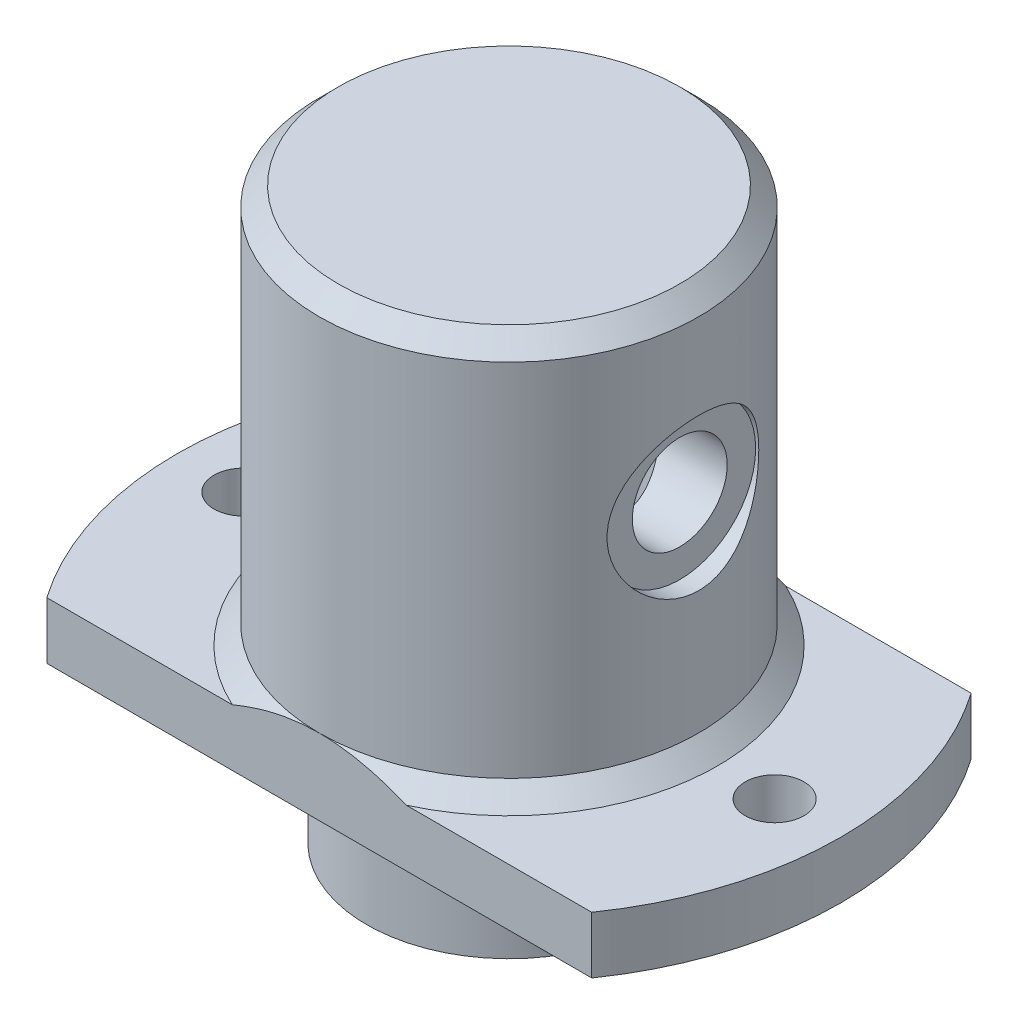
ISO-10303-21;
HEADER;
FILE_DESCRIPTION(('STEP AP214'),'2;1');
FILE_NAME('part.step','',(''),(''),'','','');
FILE_SCHEMA(('AUTOMOTIVE_DESIGN { 1 0 10303 214 1 1 1 1 }'));
ENDSEC;
DATA;
#1=APPLICATION_CONTEXT('core data for automotive mechanical design processes');
#2=APPLICATION_PROTOCOL_DEFINITION('international standard','automotive_design',2000,#1);
#3=PRODUCT_CONTEXT('',#1,'mechanical');
#4=PRODUCT('Part','Part','',(#3));
#5=PRODUCT_RELATED_PRODUCT_CATEGORY('part','',(#4));
#6=PRODUCT_DEFINITION_FORMATION('','',#4);
#7=PRODUCT_DEFINITION_CONTEXT('part definition',#1,'design');
#8=PRODUCT_DEFINITION('design','',#6,#7);
#9=PRODUCT_DEFINITION_SHAPE('','',#8);
#10=(LENGTH_UNIT() NAMED_UNIT(*) SI_UNIT(.MILLI.,.METRE.));
#11=(NAMED_UNIT(*) PLANE_ANGLE_UNIT() SI_UNIT($,.RADIAN.));
#12=(NAMED_UNIT(*) SI_UNIT($,.STERADIAN.) SOLID_ANGLE_UNIT());
#13=UNCERTAINTY_MEASURE_WITH_UNIT(LENGTH_MEASURE(1.E-05),#10,'distance_accuracy_value','');
#14=(GEOMETRIC_REPRESENTATION_CONTEXT(3) GLOBAL_UNCERTAINTY_ASSIGNED_CONTEXT((#13)) GLOBAL_UNIT_ASSIGNED_CONTEXT((#10,
#11,#12)) REPRESENTATION_CONTEXT('',''));
#15=CARTESIAN_POINT('',(0.,0.,0.));
#16=DIRECTION('',(0.,0.,1.));
#17=DIRECTION('',(1.,0.,0.));
#18=AXIS2_PLACEMENT_3D('',#15,#16,#17);
#19=CARTESIAN_POINT('',(0.,21.,0.));
#20=DIRECTION('',(0.,-1.,0.));
#21=DIRECTION('',(0.,0.,-1.));
#22=AXIS2_PLACEMENT_3D('',#19,#20,#21);
#23=CYLINDRICAL_SURFACE('',#22,10.);
#24=CARTESIAN_POINT('',(0.,1.00000000000003,0.));
#25=DIRECTION('',(0.,-1.,0.));
#26=DIRECTION('',(0.,0.,-1.));
#27=AXIS2_PLACEMENT_3D('',#24,#25,#26);
#28=CIRCLE('',#27,10.);
#29=CARTESIAN_POINT('',(0.,1.00000000000003,10.));
#30=VERTEX_POINT('',#29);
#31=CARTESIAN_POINT('',(0.,1.00000000000003,-10.));
#32=VERTEX_POINT('',#31);
#33=EDGE_CURVE('E197',#30,#32,#28,.F.);
#34=ORIENTED_EDGE('',*,*,#33,.T.);
#35=CARTESIAN_POINT('',(0.,1.00000000000003,0.));
#36=DIRECTION('',(0.,-1.,0.));
#37=DIRECTION('',(0.,0.,-1.));
#38=AXIS2_PLACEMENT_3D('',#35,#36,#37);
#39=CIRCLE('',#38,10.);
#40=EDGE_CURVE('E205',#32,#30,#39,.F.);
#41=ORIENTED_EDGE('',*,*,#40,.T.);
#42=EDGE_LOOP('',(#34,#41));
#43=FACE_BOUND('',#42,.T.);
#44=CARTESIAN_POINT('',(0.,20.,0.));
#45=DIRECTION('',(0.,1.,0.));
#46=DIRECTION('',(0.,0.,1.));
#47=AXIS2_PLACEMENT_3D('',#44,#45,#46);
#48=CIRCLE('',#47,10.);
#49=CARTESIAN_POINT('',(0.,20.,10.));
#50=VERTEX_POINT('',#49);
#51=EDGE_CURVE('E127',#50,#50,#48,.F.);
#52=ORIENTED_EDGE('',*,*,#51,.T.);
#53=EDGE_LOOP('',(#52));
#54=FACE_BOUND('',#53,.T.);
#55=CARTESIAN_POINT('',(9.16515138991168,11.5,-4.));
#56=CARTESIAN_POINT('',(9.16515220722506,11.3928225032156,-3.99999917996685));
#57=CARTESIAN_POINT('',(9.16703782704588,11.2856121402052,-3.99568627578832));
#58=CARTESIAN_POINT('',(9.17451890581268,11.0719679058293,-3.97847804504315));
#59=CARTESIAN_POINT('',(9.18011663538446,10.9655345500547,-3.965577465543));
#60=CARTESIAN_POINT('',(9.19485078616074,10.7540640466445,-3.9312935770878));
#61=CARTESIAN_POINT('',(9.20399425848326,10.6490301151513,-3.90989336356571));
#62=CARTESIAN_POINT('',(9.2255144619826,10.4413124028102,-3.85883937208579));
#63=CARTESIAN_POINT('',(9.23789253541712,10.3386296168982,-3.82918216740128));
#64=CARTESIAN_POINT('',(9.27920231487636,10.0360102733714,-3.72849978450445));
#65=CARTESIAN_POINT('',(9.31238810193524,9.84046207903567,-3.64559228099563));
#66=CARTESIAN_POINT('',(9.38629512671437,9.46619873132705,-3.45083256453888));
#67=CARTESIAN_POINT('',(9.42701471853534,9.28747991410876,-3.33898667159604));
#68=CARTESIAN_POINT('',(9.51401677460926,8.94148818639859,-3.08264624953203));
#69=CARTESIAN_POINT('',(9.56047821792022,8.77528956671102,-2.93675933272146));
#70=CARTESIAN_POINT('',(9.65224928088017,8.46893959195808,-2.61941759406606));
#71=CARTESIAN_POINT('',(9.69755849326326,8.32879733924504,-2.44795387495429));
#72=CARTESIAN_POINT('',(9.78406811808173,8.0731878901629,-2.07601279575004));
#73=CARTESIAN_POINT('',(9.82503606295845,7.95891158003059,-1.87465797803874));
#74=CARTESIAN_POINT('',(9.89607856333948,7.76631268032306,-1.45365059895514));
#75=CARTESIAN_POINT('',(9.92615755049622,7.68797546056676,-1.23400552632834));
#76=CARTESIAN_POINT('',(9.97076649749865,7.57331707267703,-0.793932865332429));
#77=CARTESIAN_POINT('',(9.98597873479394,7.53514538400194,-0.574057972725524));
#78=CARTESIAN_POINT('',(10.001606214367,7.49594301649918,-0.130532654160158));
#79=CARTESIAN_POINT('',(10.0020269755724,7.4948984849555,0.0931163324631209));
#80=CARTESIAN_POINT('',(9.98843925626005,7.52896554254646,0.524464988663932));
#81=CARTESIAN_POINT('',(9.9752399353889,7.56204954629711,0.732354905542458));
#82=CARTESIAN_POINT('',(9.93698582942363,7.6599857518182,1.1393462186423));
#83=CARTESIAN_POINT('',(9.91193017443784,7.72484028458436,1.33844696883603));
#84=CARTESIAN_POINT('',(9.85193648913816,7.88527296597229,1.72579587696675));
#85=CARTESIAN_POINT('',(9.81685520932146,7.98129942968872,1.91383524674319));
#86=CARTESIAN_POINT('',(9.7402917036085,8.20093001378034,2.27161630149723));
#87=CARTESIAN_POINT('',(9.69880728534381,8.32454358618434,2.44135168543995));
#88=CARTESIAN_POINT('',(9.61043274352156,8.60529827190481,2.76953765597606));
#89=CARTESIAN_POINT('',(9.56336653023493,8.76410778515017,2.92651569053149));
#90=CARTESIAN_POINT('',(9.47123321946549,9.10598114365943,3.21221483078645));
#91=CARTESIAN_POINT('',(9.42616678016159,9.28905289638997,3.34092668757428));
#92=CARTESIAN_POINT('',(9.34193794818039,9.68083804474915,3.56980837743822));
#93=CARTESIAN_POINT('',(9.30297828115414,9.89012966067764,3.66906930327244));
#94=CARTESIAN_POINT('',(9.23775180688171,10.3244309806241,3.83035251973301));
#95=CARTESIAN_POINT('',(9.21147675782622,10.5494303694531,3.89239899675599));
#96=CARTESIAN_POINT('',(9.17659519405431,10.994071554935,3.97390989770977));
#97=CARTESIAN_POINT('',(9.16700732912275,11.2132008942571,3.99574419362908));
#98=CARTESIAN_POINT('',(9.16378995738077,11.6521544155191,4.00312265288578));
#99=CARTESIAN_POINT('',(9.17015561120724,11.8719783665513,3.98867782118257));
#100=CARTESIAN_POINT('',(9.19712088718227,12.2929178699139,3.92606578958006));
#101=CARTESIAN_POINT('',(9.21688915596603,12.4943858748,3.87986612404771));
#102=CARTESIAN_POINT('',(9.26740102054679,12.886576809571,3.75760837382175));
#103=CARTESIAN_POINT('',(9.29814704977195,13.0772973462148,3.68154366860459));
#104=CARTESIAN_POINT('',(9.36867563720203,13.4512047155908,3.49827127896311));
#105=CARTESIAN_POINT('',(9.40877409278357,13.6337723773872,3.38992573652914));
#106=CARTESIAN_POINT('',(9.49300770315587,13.978965974885,3.14633044888379));
#107=CARTESIAN_POINT('',(9.5371444979208,14.1415837455978,3.01106974696435));
#108=CARTESIAN_POINT('',(9.62841831942843,14.4547468171913,2.70568842336055));
#109=CARTESIAN_POINT('',(9.67553614570507,14.6035131305545,2.53373085888854));
#110=CARTESIAN_POINT('',(9.76439589135024,14.8703541532482,2.16616726673934));
#111=CARTESIAN_POINT('',(9.80613759186121,14.9884276132975,1.97056027694192));
#112=CARTESIAN_POINT('',(9.87967431800929,15.1900952528195,1.56055986799732));
#113=CARTESIAN_POINT('',(9.9114717248188,15.2736976879472,1.346170961965));
#114=CARTESIAN_POINT('',(9.96145426937248,15.4030977051994,0.904787181861567));
#115=CARTESIAN_POINT('',(9.97964679410119,15.4489158043134,0.677799220674798));
#116=CARTESIAN_POINT('',(9.99958016425668,15.499009401911,0.233633020611974));
#117=CARTESIAN_POINT('',(10.0023169350655,15.5058002520768,0.0167809848943038));
#118=CARTESIAN_POINT('',(9.99372084740381,15.4842890462796,-0.414867671174725));
#119=CARTESIAN_POINT('',(9.98239011871255,15.4559923024791,-0.629664597702891));
#120=CARTESIAN_POINT('',(9.94743026789157,15.3669064057872,-1.04434180494581));
#121=CARTESIAN_POINT('',(9.92418961491738,15.3071420434949,-1.2444776131699));
#122=CARTESIAN_POINT('',(9.86789895440956,15.1578944552422,-1.63184470564404));
#123=CARTESIAN_POINT('',(9.83484713776136,15.068405747944,-1.81907360209111));
#124=CARTESIAN_POINT('',(9.76036189588764,14.8577933524316,-2.18440609879393));
#125=CARTESIAN_POINT('',(9.71862262764551,14.7354464559039,-2.3617408310488));
#126=CARTESIAN_POINT('',(9.63178803063431,14.4644239163639,-2.69410799958838));
#127=CARTESIAN_POINT('',(9.58669131729773,14.3157373759609,-2.849131156699));
#128=CARTESIAN_POINT('',(9.49475540255923,13.9853657611342,-3.14240275826141));
#129=CARTESIAN_POINT('',(9.4479811565371,13.802207701298,-3.27901865020172));
#130=CARTESIAN_POINT('',(9.36099292501489,13.4141302787523,-3.51969402497221));
#131=CARTESIAN_POINT('',(9.32077971107738,13.2092083613338,-3.62374968011082));
#132=CARTESIAN_POINT('',(9.25517900642369,12.8018760562204,-3.78798515690828));
#133=CARTESIAN_POINT('',(9.22878451494603,12.6008923240541,-3.85126569346865));
#134=CARTESIAN_POINT('',(9.1988556584339,12.2933610402093,-3.92194632104984));
#135=CARTESIAN_POINT('',(9.19049270633767,12.1899269641056,-3.94146052144918));
#136=CARTESIAN_POINT('',(9.17721200341611,11.9816430703891,-3.97228850679684));
#137=CARTESIAN_POINT('',(9.17229225293171,11.8767941106041,-3.98360705155155));
#138=CARTESIAN_POINT('',(9.16783675423417,11.7264494086476,-3.99384232103284));
#139=CARTESIAN_POINT('',(9.16683059815414,11.6812001696778,-3.99615058414993));
#140=CARTESIAN_POINT('',(9.16548771864777,11.5906359157854,-3.99922965337524));
#141=CARTESIAN_POINT('',(9.16515104430392,11.5453208962838,-4.00000034675784));
#142=CARTESIAN_POINT('',(9.16515138991168,11.5,-4.));
#143=B_SPLINE_CURVE_WITH_KNOTS('',3,(#55,#56,#57,#58,#59,#60,#61,#62,#63,#64,#65,#66,#67,#68,
#69,#70,#71,#72,#73,#74,#75,#76,#77,#78,#79,#80,#81,#82,#83,#84,#85,#86,#87,#88,#89,#90,#91,#92,
#93,#94,#95,#96,#97,#98,#99,#100,#101,#102,#103,#104,#105,#106,#107,#108,#109,#110,#111,#112,
#113,#114,#115,#116,#117,#118,#119,#120,#121,#122,#123,#124,#125,#126,#127,#128,#129,#130,#131,
#132,#133,#134,#135,#136,#137,#138,#139,#140,#141,#142),.UNSPECIFIED.,.T.,.F.,(4,2,2,2,2,2,2,2,
2,2,2,2,2,2,2,2,2,2,2,2,2,2,2,2,2,2,2,2,2,2,2,2,2,2,2,2,2,2,2,2,2,2,2,4),(0.,0.321486083338405,
0.643168995111192,0.965494918272706,1.28795480954363,1.92974178448592,2.57138871437637,
3.24631250358764,3.92147162486599,4.62325351972771,5.32474947728875,5.99228379564281,
6.65956904401258,7.28937303450519,7.91922324048033,8.5585661425971,9.19812843669977,
9.87968101952626,10.5614562804417,11.2624893122443,11.9630662339012,12.6208430883876,
13.2784204360579,13.898545099602,14.5188073109319,15.1642232309532,15.8099024284161,
16.5032748228387,17.1966754349541,17.8899098841554,18.5827676569819,19.2304209330182,
19.8779761681512,20.5056400267662,21.1334196944709,21.7889411606977,22.4447344691833,
23.1411252036114,23.8375977730829,24.4715333542807,24.7879924179097,25.1042675432749,
25.240200643082,25.3761437083411),.UNSPECIFIED.);
#144=CARTESIAN_POINT('',(9.16515138991168,11.5,-4.));
#145=VERTEX_POINT('',#144);
#146=EDGE_CURVE('E124',#145,#145,#143,.T.);
#147=ORIENTED_EDGE('',*,*,#146,.T.);
#148=EDGE_LOOP('',(#147));
#149=FACE_BOUND('',#148,.T.);
#150=ADVANCED_FACE('F35',(#43,#54,#149),#23,.T.);
#151=CARTESIAN_POINT('',(0.,21.,0.));
#152=DIRECTION('',(0.,1.,0.));
#153=DIRECTION('',(0.,0.,1.));
#154=AXIS2_PLACEMENT_3D('',#151,#152,#153);
#155=PLANE('',#154);
#156=CARTESIAN_POINT('',(0.,21.,0.));
#157=DIRECTION('',(0.,1.,0.));
#158=DIRECTION('',(0.,0.,1.));
#159=AXIS2_PLACEMENT_3D('',#156,#157,#158);
#160=CIRCLE('',#159,9.00000000000001);
#161=CARTESIAN_POINT('',(0.,21.,9.00000000000001));
#162=VERTEX_POINT('',#161);
#163=EDGE_CURVE('E213',#162,#162,#160,.T.);
#164=ORIENTED_EDGE('',*,*,#163,.T.);
#165=EDGE_LOOP('',(#164));
#166=FACE_BOUND('',#165,.T.);
#167=ADVANCED_FACE('F187',(#166),#155,.T.);
#168=CARTESIAN_POINT('',(0.,0.,0.));
#169=DIRECTION('',(0.,-1.,0.));
#170=DIRECTION('',(0.,0.,-1.));
#171=AXIS2_PLACEMENT_3D('',#168,#169,#170);
#172=PLANE('',#171);
#173=DIRECTION('',(1.,0.,0.));
#174=VECTOR('',#173,1.);
#175=CARTESIAN_POINT('',(-14.3614066163451,0.,-10.));
#176=LINE('',#175,#174);
#177=CARTESIAN_POINT('',(4.58257569495589,0.,-10.));
#178=VERTEX_POINT('',#177);
#179=CARTESIAN_POINT('',(14.3614066163451,0.,-10.));
#180=VERTEX_POINT('',#179);
#181=EDGE_CURVE('E267',#178,#180,#176,.T.);
#182=ORIENTED_EDGE('',*,*,#181,.F.);
#183=CARTESIAN_POINT('',(0.,0.,0.));
#184=DIRECTION('',(0.,-1.,0.));
#185=DIRECTION('',(0.,0.,-1.));
#186=AXIS2_PLACEMENT_3D('',#183,#184,#185);
#187=CIRCLE('',#186,11.);
#188=CARTESIAN_POINT('',(4.5825756949559,0.,10.));
#189=VERTEX_POINT('',#188);
#190=EDGE_CURVE('E211',#178,#189,#187,.T.);
#191=ORIENTED_EDGE('',*,*,#190,.T.);
#192=DIRECTION('',(-1.,0.,0.));
#193=VECTOR('',#192,1.);
#194=CARTESIAN_POINT('',(-14.3614066163451,0.,10.));
#195=LINE('',#194,#193);
#196=CARTESIAN_POINT('',(14.3614066163451,0.,10.));
#197=VERTEX_POINT('',#196);
#198=EDGE_CURVE('E268',#197,#189,#195,.T.);
#199=ORIENTED_EDGE('',*,*,#198,.F.);
#200=CARTESIAN_POINT('',(0.,0.,0.));
#201=DIRECTION('',(0.,-1.,0.));
#202=DIRECTION('',(0.,0.,-1.));
#203=AXIS2_PLACEMENT_3D('',#200,#201,#202);
#204=CIRCLE('',#203,17.5);
#205=EDGE_CURVE('E123',#180,#197,#204,.T.);
#206=ORIENTED_EDGE('',*,*,#205,.F.);
#207=EDGE_LOOP('',(#182,#191,#199,#206));
#208=FACE_BOUND('',#207,.T.);
#209=CARTESIAN_POINT('',(14.,0.,0.));
#210=DIRECTION('',(0.,-1.,0.));
#211=DIRECTION('',(0.,0.,-1.));
#212=AXIS2_PLACEMENT_3D('',#209,#210,#211);
#213=CIRCLE('',#212,1.55);
#214=CARTESIAN_POINT('',(14.,0.,-1.55));
#215=VERTEX_POINT('',#214);
#216=EDGE_CURVE('E289',#215,#215,#213,.T.);
#217=ORIENTED_EDGE('',*,*,#216,.T.);
#218=EDGE_LOOP('',(#217));
#219=FACE_BOUND('',#218,.T.);
#220=ADVANCED_FACE('F192',(#208,#219),#172,.F.);
#221=CARTESIAN_POINT('',(0.,-3.,0.));
#222=DIRECTION('',(0.,-1.,0.));
#223=DIRECTION('',(0.,0.,-1.));
#224=AXIS2_PLACEMENT_3D('',#221,#222,#223);
#225=PLANE('',#224);
#226=CARTESIAN_POINT('',(0.,-3.,0.));
#227=DIRECTION('',(0.,-1.,0.));
#228=DIRECTION('',(0.,0.,-1.));
#229=AXIS2_PLACEMENT_3D('',#226,#227,#228);
#230=CIRCLE('',#229,7.5);
#231=CARTESIAN_POINT('',(0.,-3.,-7.5));
#232=VERTEX_POINT('',#231);
#233=EDGE_CURVE('E298',#232,#232,#230,.T.);
#234=ORIENTED_EDGE('',*,*,#233,.F.);
#235=EDGE_LOOP('',(#234));
#236=FACE_BOUND('',#235,.T.);
#237=CARTESIAN_POINT('',(-14.,-3.,0.));
#238=DIRECTION('',(0.,-1.,0.));
#239=DIRECTION('',(0.,0.,-1.));
#240=AXIS2_PLACEMENT_3D('',#237,#238,#239);
#241=CIRCLE('',#240,1.55);
#242=CARTESIAN_POINT('',(-14.,-3.,-1.55));
#243=VERTEX_POINT('',#242);
#244=EDGE_CURVE('E280',#243,#243,#241,.T.);
#245=ORIENTED_EDGE('',*,*,#244,.F.);
#246=EDGE_LOOP('',(#245));
#247=FACE_BOUND('',#246,.T.);
#248=CARTESIAN_POINT('',(0.,-3.,0.));
#249=DIRECTION('',(0.,-1.,0.));
#250=DIRECTION('',(0.,0.,-1.));
#251=AXIS2_PLACEMENT_3D('',#248,#249,#250);
#252=CIRCLE('',#251,17.5);
#253=CARTESIAN_POINT('',(14.3614066163451,-3.,-10.));
#254=VERTEX_POINT('',#253);
#255=CARTESIAN_POINT('',(14.3614066163451,-3.,10.));
#256=VERTEX_POINT('',#255);
#257=EDGE_CURVE('E109',#254,#256,#252,.T.);
#258=ORIENTED_EDGE('',*,*,#257,.T.);
#259=DIRECTION('',(-1.,0.,0.));
#260=VECTOR('',#259,1.);
#261=CARTESIAN_POINT('',(-14.3614066163451,-3.,10.));
#262=LINE('',#261,#260);
#263=CARTESIAN_POINT('',(-14.3614066163451,-3.,9.99999999999999));
#264=VERTEX_POINT('',#263);
#265=EDGE_CURVE('E98',#256,#264,#262,.T.);
#266=ORIENTED_EDGE('',*,*,#265,.T.);
#267=CARTESIAN_POINT('',(0.,-3.,0.));
#268=DIRECTION('',(0.,-1.,0.));
#269=DIRECTION('',(0.,0.,-1.));
#270=AXIS2_PLACEMENT_3D('',#267,#268,#269);
#271=CIRCLE('',#270,17.5);
#272=CARTESIAN_POINT('',(-14.3614066163451,-3.,-10.));
#273=VERTEX_POINT('',#272);
#274=EDGE_CURVE('E108',#264,#273,#271,.T.);
#275=ORIENTED_EDGE('',*,*,#274,.T.);
#276=DIRECTION('',(1.,0.,0.));
#277=VECTOR('',#276,1.);
#278=CARTESIAN_POINT('',(-14.3614066163451,-3.,-10.));
#279=LINE('',#278,#277);
#280=EDGE_CURVE('E115',#273,#254,#279,.T.);
#281=ORIENTED_EDGE('',*,*,#280,.T.);
#282=EDGE_LOOP('',(#258,#266,#275,#281));
#283=FACE_BOUND('',#282,.T.);
#284=CARTESIAN_POINT('',(14.,-3.,0.));
#285=DIRECTION('',(0.,-1.,0.));
#286=DIRECTION('',(0.,0.,-1.));
#287=AXIS2_PLACEMENT_3D('',#284,#285,#286);
#288=CIRCLE('',#287,1.55);
#289=CARTESIAN_POINT('',(14.,-3.,-1.55));
#290=VERTEX_POINT('',#289);
#291=EDGE_CURVE('E291',#290,#290,#288,.T.);
#292=ORIENTED_EDGE('',*,*,#291,.F.);
#293=EDGE_LOOP('',(#292));
#294=FACE_BOUND('',#293,.T.);
#295=ADVANCED_FACE('F112',(#236,#247,#283,#294),#225,.T.);
#296=CARTESIAN_POINT('',(-4.5825756949559,0.,10.));
#297=VERTEX_POINT('',#296);
#298=CARTESIAN_POINT('',(-14.3614066163451,0.,9.99999999999999));
#299=VERTEX_POINT('',#298);
#300=EDGE_CURVE('E279',#297,#299,#195,.T.);
#301=ORIENTED_EDGE('',*,*,#300,.F.);
#302=CARTESIAN_POINT('',(0.,0.,0.));
#303=DIRECTION('',(0.,-1.,0.));
#304=DIRECTION('',(0.,0.,-1.));
#305=AXIS2_PLACEMENT_3D('',#302,#303,#304);
#306=CIRCLE('',#305,11.);
#307=CARTESIAN_POINT('',(-4.5825756949559,0.,-10.));
#308=VERTEX_POINT('',#307);
#309=EDGE_CURVE('E206',#297,#308,#306,.T.);
#310=ORIENTED_EDGE('',*,*,#309,.T.);
#311=CARTESIAN_POINT('',(-14.3614066163451,0.,-10.));
#312=VERTEX_POINT('',#311);
#313=EDGE_CURVE('E119',#312,#308,#176,.T.);
#314=ORIENTED_EDGE('',*,*,#313,.F.);
#315=CARTESIAN_POINT('',(0.,0.,0.));
#316=DIRECTION('',(0.,-1.,0.));
#317=DIRECTION('',(0.,0.,-1.));
#318=AXIS2_PLACEMENT_3D('',#315,#316,#317);
#319=CIRCLE('',#318,17.5);
#320=EDGE_CURVE('E262',#299,#312,#319,.T.);
#321=ORIENTED_EDGE('',*,*,#320,.F.);
#322=EDGE_LOOP('',(#301,#310,#314,#321));
#323=FACE_BOUND('',#322,.T.);
#324=CARTESIAN_POINT('',(-14.,0.,0.));
#325=DIRECTION('',(0.,-1.,0.));
#326=DIRECTION('',(0.,0.,-1.));
#327=AXIS2_PLACEMENT_3D('',#324,#325,#326);
#328=CIRCLE('',#327,1.55);
#329=CARTESIAN_POINT('',(-14.,0.,-1.55));
#330=VERTEX_POINT('',#329);
#331=EDGE_CURVE('E295',#330,#330,#328,.T.);
#332=ORIENTED_EDGE('',*,*,#331,.T.);
#333=EDGE_LOOP('',(#332));
#334=FACE_BOUND('',#333,.T.);
#335=ADVANCED_FACE('F252',(#323,#334),#172,.F.);
#336=CARTESIAN_POINT('',(0.,-3.,0.));
#337=DIRECTION('',(0.,1.,0.));
#338=DIRECTION('',(0.,0.,1.));
#339=AXIS2_PLACEMENT_3D('',#336,#337,#338);
#340=CYLINDRICAL_SURFACE('',#339,17.5);
#341=ORIENTED_EDGE('',*,*,#205,.T.);
#342=DIRECTION('',(0.,1.,0.));
#343=VECTOR('',#342,1.);
#344=CARTESIAN_POINT('',(14.3614066163451,-3.,10.));
#345=LINE('',#344,#343);
#346=EDGE_CURVE('E102',#256,#197,#345,.T.);
#347=ORIENTED_EDGE('',*,*,#346,.F.);
#348=ORIENTED_EDGE('',*,*,#257,.F.);
#349=DIRECTION('',(0.,1.,0.));
#350=VECTOR('',#349,1.);
#351=CARTESIAN_POINT('',(14.3614066163451,-3.,-10.));
#352=LINE('',#351,#350);
#353=EDGE_CURVE('E270',#254,#180,#352,.T.);
#354=ORIENTED_EDGE('',*,*,#353,.T.);
#355=EDGE_LOOP('',(#341,#347,#348,#354));
#356=FACE_BOUND('',#355,.T.);
#357=ADVANCED_FACE('F121',(#356),#340,.T.);
#358=CARTESIAN_POINT('',(-14.3614066163451,-3.,10.));
#359=DIRECTION('',(0.,0.,-1.));
#360=DIRECTION('',(-1.,0.,0.));
#361=AXIS2_PLACEMENT_3D('',#358,#359,#360);
#362=PLANE('',#361);
#363=ORIENTED_EDGE('',*,*,#198,.T.);
#364=CARTESIAN_POINT('',(4.5825756949559,0.,10.));
#365=CARTESIAN_POINT('',(4.40028329745411,0.0759300000432004,10.));
#366=CARTESIAN_POINT('',(4.21668434662444,0.148681819850932,10.));
#367=CARTESIAN_POINT('',(3.84668711964446,0.287043110849079,10.));
#368=CARTESIAN_POINT('',(3.66028713858143,0.352648013442158,10.));
#369=CARTESIAN_POINT('',(3.10086162076169,0.536141279026051,10.));
#370=CARTESIAN_POINT('',(2.72381902600783,0.64232135628312,10.));
#371=CARTESIAN_POINT('',(2.15145029539181,0.772876295846176,10.));
#372=CARTESIAN_POINT('',(1.95932775328553,0.811633496353501,10.));
#373=CARTESIAN_POINT('',(1.57326186543213,0.878782819797943,10.));
#374=CARTESIAN_POINT('',(1.37931860628591,0.907175433181611,10.));
#375=CARTESIAN_POINT('',(0.988206780234233,0.953182708658288,10.));
#376=CARTESIAN_POINT('',(0.791025283499153,0.970688028156759,10.));
#377=CARTESIAN_POINT('',(0.395902718657359,0.99412298149305,10.));
#378=CARTESIAN_POINT('',(0.197961387964168,1.00004816794042,10.));
#379=CARTESIAN_POINT('',(0.,1.00000000000003,10.));
#380=B_SPLINE_CURVE_WITH_KNOTS('',3,(#364,#365,#366,#367,#368,#369,#370,#371,#372,#373,#374,
#375,#376,#377,#378,#379),.UNSPECIFIED.,.F.,.F.,(4,2,2,2,2,2,2,4),(0.,0.592342369633584,
1.18506119357528,2.3581712871934,2.94592281647596,3.53364653007368,4.12718135483281,
4.72094408395065),.UNSPECIFIED.);
#381=EDGE_CURVE('E11',#189,#30,#380,.T.);
#382=ORIENTED_EDGE('',*,*,#381,.T.);
#383=CARTESIAN_POINT('',(0.,1.00000000000003,10.));
#384=CARTESIAN_POINT('',(-0.15341966301541,1.00001776241592,10.));
#385=CARTESIAN_POINT('',(-0.306833269140139,0.996469832744764,10.));
#386=CARTESIAN_POINT('',(-0.613315443693135,0.982374515703792,10.));
#387=CARTESIAN_POINT('',(-0.766384062318434,0.97182822280088,10.));
#388=CARTESIAN_POINT('',(-1.07166096213251,0.943889128848256,10.));
#389=CARTESIAN_POINT('',(-1.22387019312159,0.926506684934031,10.));
#390=CARTESIAN_POINT('',(-1.52738320749771,0.885145307523191,10.));
#391=CARTESIAN_POINT('',(-1.67868696596959,0.861166193356339,10.));
#392=CARTESIAN_POINT('',(-2.12685071573968,0.780508732346216,10.));
#393=CARTESIAN_POINT('',(-2.42210425955915,0.714714723773777,10.));
#394=CARTESIAN_POINT('',(-3.00688490566493,0.561532640412127,10.));
#395=CARTESIAN_POINT('',(-3.29641147680472,0.474142572750092,10.));
#396=CARTESIAN_POINT('',(-3.75125759759243,0.320732059251724,10.));
#397=CARTESIAN_POINT('',(-3.91864293763952,0.260724484132005,10.));
#398=CARTESIAN_POINT('',(-4.25191342087301,0.134692876743674,10.));
#399=CARTESIAN_POINT('',(-4.41778971858567,0.0686454153836086,10.));
#400=CARTESIAN_POINT('',(-4.5825756949559,0.,10.));
#401=B_SPLINE_CURVE_WITH_KNOTS('',3,(#383,#384,#385,#386,#387,#388,#389,#390,#391,#392,#393,
#394,#395,#396,#397,#398,#399,#400),.UNSPECIFIED.,.F.,.F.,(4,2,2,2,2,2,2,2,4),(0.,
0.460207930915159,0.920343907336783,1.37978542217498,1.83923952149435,2.74570852905117,
3.65226121634107,4.18561484858962,4.72113306860318),.UNSPECIFIED.);
#402=EDGE_CURVE('E216',#30,#297,#401,.T.);
#403=ORIENTED_EDGE('',*,*,#402,.T.);
#404=ORIENTED_EDGE('',*,*,#300,.T.);
#405=DIRECTION('',(0.,1.,0.));
#406=VECTOR('',#405,1.);
#407=CARTESIAN_POINT('',(-14.3614066163451,-3.,9.99999999999999));
#408=LINE('',#407,#406);
#409=EDGE_CURVE('E105',#264,#299,#408,.T.);
#410=ORIENTED_EDGE('',*,*,#409,.F.);
#411=ORIENTED_EDGE('',*,*,#265,.F.);
#412=ORIENTED_EDGE('',*,*,#346,.T.);
#413=EDGE_LOOP('',(#363,#382,#403,#404,#410,#411,#412));
#414=FACE_BOUND('',#413,.T.);
#415=ADVANCED_FACE('F100',(#414),#362,.F.);
#416=CARTESIAN_POINT('',(0.,-3.,0.));
#417=DIRECTION('',(0.,1.,0.));
#418=DIRECTION('',(0.,0.,1.));
#419=AXIS2_PLACEMENT_3D('',#416,#417,#418);
#420=CYLINDRICAL_SURFACE('',#419,17.5);
#421=ORIENTED_EDGE('',*,*,#320,.T.);
#422=DIRECTION('',(0.,1.,0.));
#423=VECTOR('',#422,1.);
#424=CARTESIAN_POINT('',(-14.3614066163451,-3.,-10.));
#425=LINE('',#424,#423);
#426=EDGE_CURVE('E129',#273,#312,#425,.T.);
#427=ORIENTED_EDGE('',*,*,#426,.F.);
#428=ORIENTED_EDGE('',*,*,#274,.F.);
#429=ORIENTED_EDGE('',*,*,#409,.T.);
#430=EDGE_LOOP('',(#421,#427,#428,#429));
#431=FACE_BOUND('',#430,.T.);
#432=ADVANCED_FACE('F251',(#431),#420,.T.);
#433=CARTESIAN_POINT('',(-14.3614066163451,-3.,-10.));
#434=DIRECTION('',(0.,0.,1.));
#435=DIRECTION('',(1.,0.,0.));
#436=AXIS2_PLACEMENT_3D('',#433,#434,#435);
#437=PLANE('',#436);
#438=ORIENTED_EDGE('',*,*,#313,.T.);
#439=CARTESIAN_POINT('',(-4.58257569495589,0.,-10.));
#440=CARTESIAN_POINT('',(-4.40028329745411,0.0759300000432026,-10.));
#441=CARTESIAN_POINT('',(-4.21668434662443,0.148681819850934,-10.));
#442=CARTESIAN_POINT('',(-3.84668711964446,0.28704311084908,-10.));
#443=CARTESIAN_POINT('',(-3.66028713858142,0.352648013442159,-10.));
#444=CARTESIAN_POINT('',(-3.10086162076169,0.536141279026051,-10.));
#445=CARTESIAN_POINT('',(-2.72381902600783,0.642321356283121,-10.));
#446=CARTESIAN_POINT('',(-2.15145029539181,0.772876295846176,-10.));
#447=CARTESIAN_POINT('',(-1.95932775328553,0.8116334963535,-10.));
#448=CARTESIAN_POINT('',(-1.57326186543213,0.878782819797941,-10.));
#449=CARTESIAN_POINT('',(-1.37931860628591,0.907175433181609,-10.));
#450=CARTESIAN_POINT('',(-0.988206780234231,0.953182708658286,-10.));
#451=CARTESIAN_POINT('',(-0.791025283499151,0.970688028156758,-10.));
#452=CARTESIAN_POINT('',(-0.395902718657357,0.994122981493051,-10.));
#453=CARTESIAN_POINT('',(-0.197961387964167,1.00004816794042,-10.));
#454=CARTESIAN_POINT('',(0.,1.00000000000003,-10.));
#455=B_SPLINE_CURVE_WITH_KNOTS('',3,(#439,#440,#441,#442,#443,#444,#445,#446,#447,#448,#449,
#450,#451,#452,#453,#454),.UNSPECIFIED.,.F.,.F.,(4,2,2,2,2,2,2,4),(0.,0.592342369633584,
1.18506119357527,2.3581712871934,2.94592281647596,3.53364653007368,4.12718135483281,
4.72094408395065),.UNSPECIFIED.);
#456=EDGE_CURVE('E56',#308,#32,#455,.T.);
#457=ORIENTED_EDGE('',*,*,#456,.T.);
#458=CARTESIAN_POINT('',(0.,1.00000000000003,-10.));
#459=CARTESIAN_POINT('',(0.153419663015411,1.00001776241592,-10.));
#460=CARTESIAN_POINT('',(0.306833269140141,0.996469832744762,-10.));
#461=CARTESIAN_POINT('',(0.613315443693136,0.982374515703791,-10.));
#462=CARTESIAN_POINT('',(0.766384062318436,0.971828222800878,-10.));
#463=CARTESIAN_POINT('',(1.07166096213251,0.943889128848254,-10.));
#464=CARTESIAN_POINT('',(1.22387019312159,0.92650668493403,-10.));
#465=CARTESIAN_POINT('',(1.52738320749771,0.885145307523189,-10.));
#466=CARTESIAN_POINT('',(1.67868696596959,0.861166193356337,-10.));
#467=CARTESIAN_POINT('',(2.12685071573968,0.780508732346214,-10.));
#468=CARTESIAN_POINT('',(2.42210425955915,0.714714723773773,-10.));
#469=CARTESIAN_POINT('',(3.00688490566494,0.561532640412124,-10.));
#470=CARTESIAN_POINT('',(3.29641147680472,0.47414257275009,-10.));
#471=CARTESIAN_POINT('',(3.75125759759244,0.320732059251722,-10.));
#472=CARTESIAN_POINT('',(3.91864293763952,0.260724484132003,-10.));
#473=CARTESIAN_POINT('',(4.25191342087301,0.134692876743672,-10.));
#474=CARTESIAN_POINT('',(4.41778971858567,0.0686454153836066,-10.));
#475=CARTESIAN_POINT('',(4.5825756949559,0.,-10.));
#476=B_SPLINE_CURVE_WITH_KNOTS('',3,(#458,#459,#460,#461,#462,#463,#464,#465,#466,#467,#468,
#469,#470,#471,#472,#473,#474,#475),.UNSPECIFIED.,.F.,.F.,(4,2,2,2,2,2,2,2,4),(0.,
0.460207930915158,0.920343907336783,1.37978542217498,1.83923952149435,2.74570852905117,
3.65226121634107,4.18561484858961,4.72113306860317),.UNSPECIFIED.);
#477=EDGE_CURVE('E49',#32,#178,#476,.T.);
#478=ORIENTED_EDGE('',*,*,#477,.T.);
#479=ORIENTED_EDGE('',*,*,#181,.T.);
#480=ORIENTED_EDGE('',*,*,#353,.F.);
#481=ORIENTED_EDGE('',*,*,#280,.F.);
#482=ORIENTED_EDGE('',*,*,#426,.T.);
#483=EDGE_LOOP('',(#438,#457,#478,#479,#480,#481,#482));
#484=FACE_BOUND('',#483,.T.);
#485=ADVANCED_FACE('F246',(#484),#437,.F.);
#486=CARTESIAN_POINT('',(-14.,-3.,0.));
#487=DIRECTION('',(0.,1.,0.));
#488=DIRECTION('',(0.,0.,1.));
#489=AXIS2_PLACEMENT_3D('',#486,#487,#488);
#490=CYLINDRICAL_SURFACE('',#489,1.55);
#491=ORIENTED_EDGE('',*,*,#244,.T.);
#492=EDGE_LOOP('',(#491));
#493=FACE_BOUND('',#492,.T.);
#494=ORIENTED_EDGE('',*,*,#331,.F.);
#495=EDGE_LOOP('',(#494));
#496=FACE_BOUND('',#495,.T.);
#497=ADVANCED_FACE('F250',(#493,#496),#490,.F.);
#498=CARTESIAN_POINT('',(14.,-3.,0.));
#499=DIRECTION('',(0.,1.,0.));
#500=DIRECTION('',(0.,0.,1.));
#501=AXIS2_PLACEMENT_3D('',#498,#499,#500);
#502=CYLINDRICAL_SURFACE('',#501,1.55);
#503=ORIENTED_EDGE('',*,*,#291,.T.);
#504=EDGE_LOOP('',(#503));
#505=FACE_BOUND('',#504,.T.);
#506=ORIENTED_EDGE('',*,*,#216,.F.);
#507=EDGE_LOOP('',(#506));
#508=FACE_BOUND('',#507,.T.);
#509=ADVANCED_FACE('F308',(#505,#508),#502,.F.);
#510=CARTESIAN_POINT('',(0.,-9.,0.));
#511=DIRECTION('',(0.,1.,0.));
#512=DIRECTION('',(0.,0.,1.));
#513=AXIS2_PLACEMENT_3D('',#510,#511,#512);
#514=CYLINDRICAL_SURFACE('',#513,7.5);
#515=CARTESIAN_POINT('',(0.,-9.,0.));
#516=DIRECTION('',(0.,-1.,0.));
#517=DIRECTION('',(0.,0.,-1.));
#518=AXIS2_PLACEMENT_3D('',#515,#516,#517);
#519=CIRCLE('',#518,7.5);
#520=CARTESIAN_POINT('',(0.,-9.,-7.5));
#521=VERTEX_POINT('',#520);
#522=EDGE_CURVE('E292',#521,#521,#519,.T.);
#523=ORIENTED_EDGE('',*,*,#522,.F.);
#524=EDGE_LOOP('',(#523));
#525=FACE_BOUND('',#524,.T.);
#526=ORIENTED_EDGE('',*,*,#233,.T.);
#527=EDGE_LOOP('',(#526));
#528=FACE_BOUND('',#527,.T.);
#529=ADVANCED_FACE('F314',(#525,#528),#514,.T.);
#530=CARTESIAN_POINT('',(0.,-9.,0.));
#531=DIRECTION('',(0.,-1.,0.));
#532=DIRECTION('',(0.,0.,-1.));
#533=AXIS2_PLACEMENT_3D('',#530,#531,#532);
#534=PLANE('',#533);
#535=CARTESIAN_POINT('',(0.,-9.,0.));
#536=DIRECTION('',(0.,-1.,0.));
#537=DIRECTION('',(0.,0.,-1.));
#538=AXIS2_PLACEMENT_3D('',#535,#536,#537);
#539=CIRCLE('',#538,6.);
#540=CARTESIAN_POINT('',(0.,-9.,-6.));
#541=VERTEX_POINT('',#540);
#542=EDGE_CURVE('E329',#541,#541,#539,.T.);
#543=ORIENTED_EDGE('',*,*,#542,.F.);
#544=EDGE_LOOP('',(#543));
#545=FACE_BOUND('',#544,.T.);
#546=ORIENTED_EDGE('',*,*,#522,.T.);
#547=EDGE_LOOP('',(#546));
#548=FACE_BOUND('',#547,.T.);
#549=ADVANCED_FACE('F158',(#545,#548),#534,.T.);
#550=CARTESIAN_POINT('',(0.,16.,0.));
#551=DIRECTION('',(0.,-1.,0.));
#552=DIRECTION('',(0.,0.,-1.));
#553=AXIS2_PLACEMENT_3D('',#550,#551,#552);
#554=CYLINDRICAL_SURFACE('',#553,6.);
#555=CARTESIAN_POINT('',(5.45435605731786,11.5,-2.5));
#556=CARTESIAN_POINT('',(5.45435734054166,11.5667081831549,-2.49999850025921));
#557=CARTESIAN_POINT('',(5.4555854329,11.6334347921685,-2.49732449538893));
#558=CARTESIAN_POINT('',(5.460451257595,11.766386478403,-2.48666416485593));
#559=CARTESIAN_POINT('',(5.46409042196574,11.8326112338951,-2.47867468210214));
#560=CARTESIAN_POINT('',(5.47848490817198,12.0300518667706,-2.44679265931592));
#561=CARTESIAN_POINT('',(5.49271671920564,12.1598368164295,-2.41498683408238));
#562=CARTESIAN_POINT('',(5.52853615769555,12.4111547641313,-2.33180001337599));
#563=CARTESIAN_POINT('',(5.55009376241033,12.5327190520916,-2.28049881438598));
#564=CARTESIAN_POINT('',(5.59808356001864,12.765510176557,-2.16001268934738));
#565=CARTESIAN_POINT('',(5.62451459938574,12.8767394499768,-2.09083199376537));
#566=CARTESIAN_POINT('',(5.68111508149861,13.0926539820894,-1.93194778443699));
#567=CARTESIAN_POINT('',(5.71141131571833,13.1966157970475,-1.84130648149063));
#568=CARTESIAN_POINT('',(5.77128595332677,13.3883997651745,-1.64404334636732));
#569=CARTESIAN_POINT('',(5.80086407614999,13.4762156955111,-1.53741538134828));
#570=CARTESIAN_POINT('',(5.8575107455344,13.6368992555286,-1.30552678905514));
#571=CARTESIAN_POINT('',(5.88441479600862,13.7089533078815,-1.17965858775786));
#572=CARTESIAN_POINT('',(5.93113040336416,13.8305519892175,-0.91626404433434));
#573=CARTESIAN_POINT('',(5.95094510785638,13.8801066103974,-0.778742909642266));
#574=CARTESIAN_POINT('',(5.98035041998162,13.9526789303404,-0.503536996147009));
#575=CARTESIAN_POINT('',(5.99041942231785,13.9769433932332,-0.36623315241801));
#576=CARTESIAN_POINT('',(6.00093657245546,14.002275278892,-0.0891583607041747));
#577=CARTESIAN_POINT('',(6.00138862268061,14.0033521108742,0.0506115635357654));
#578=CARTESIAN_POINT('',(5.99290258260449,13.9829314389708,0.319585560218812));
#579=CARTESIAN_POINT('',(5.98453429295767,13.9628037991731,0.448914977212892));
#580=CARTESIAN_POINT('',(5.96013033502178,13.9028937944991,0.702165787864646));
#581=CARTESIAN_POINT('',(5.94409410149732,13.8631099806788,0.826086782110446));
#582=CARTESIAN_POINT('',(5.90559704827471,13.7645439182725,1.06727623615443));
#583=CARTESIAN_POINT('',(5.88304194251414,13.7054810742758,1.18441435414909));
#584=CARTESIAN_POINT('',(5.83371427980366,13.5703084865819,1.40742353456466));
#585=CARTESIAN_POINT('',(5.80694023334947,13.4941927183022,1.51329059551623));
#586=CARTESIAN_POINT('',(5.74963397551513,13.3208351591992,1.7186818234134));
#587=CARTESIAN_POINT('',(5.71896988702082,13.222482417457,1.81723287462318));
#588=CARTESIAN_POINT('',(5.65875721372882,13.0105771185719,1.99686282986464));
#589=CARTESIAN_POINT('',(5.62920906299902,12.8970187233643,2.0779349916834));
#590=CARTESIAN_POINT('',(5.57363224672088,12.6532099267203,2.22280378497075));
#591=CARTESIAN_POINT('',(5.54775116967603,12.5225335886945,2.28594506698397));
#592=CARTESIAN_POINT('',(5.50419688296718,12.2510379102374,2.38892864103959));
#593=CARTESIAN_POINT('',(5.48651780631503,12.1102259035158,2.42878759251237));
#594=CARTESIAN_POINT('',(5.46282425074792,11.832206382133,2.48160050339178));
#595=CARTESIAN_POINT('',(5.45612738403682,11.6953577554715,2.49613229266517));
#596=CARTESIAN_POINT('',(5.45320573611839,11.4210430351874,2.50251261037213));
#597=CARTESIAN_POINT('',(5.45697733196184,11.2835771716193,2.49436898636095));
#598=CARTESIAN_POINT('',(5.47386262693795,11.0212032291366,2.45706955131303));
#599=CARTESIAN_POINT('',(5.48636276033852,10.8960546264258,2.42929237636148));
#600=CARTESIAN_POINT('',(5.51851260594277,10.6522974070048,2.355341171284));
#601=CARTESIAN_POINT('',(5.53816398920152,10.5336903263384,2.30916284106237));
#602=CARTESIAN_POINT('',(5.58341595714177,10.3007693792872,2.19755041610386));
#603=CARTESIAN_POINT('',(5.60923324404617,10.1868500507806,2.13138366612393));
#604=CARTESIAN_POINT('',(5.66360007481535,9.97118389500067,1.98240156877197));
#605=CARTESIAN_POINT('',(5.69215079841133,9.86944236659127,1.89957901575222));
#606=CARTESIAN_POINT('',(5.75157239569101,9.67239973023739,1.71168891143075));
#607=CARTESIAN_POINT('',(5.78244293417774,9.57829720011966,1.6053593229584));
#608=CARTESIAN_POINT('',(5.84086722367755,9.40905541602037,1.37770302510816));
#609=CARTESIAN_POINT('',(5.868420731537,9.3339175517941,1.25637521761135));
#610=CARTESIAN_POINT('',(5.91728503171628,9.20482024919155,1.00130936160273));
#611=CARTESIAN_POINT('',(5.93857966278875,9.15091551771517,0.867540339261896));
#612=CARTESIAN_POINT('',(5.9723634620551,9.06676641503718,0.591717670323946));
#613=CARTESIAN_POINT('',(5.98485787035282,9.036507962451,0.449669008506775));
#614=CARTESIAN_POINT('',(5.9990306959926,9.00228374997958,0.172033066960382));
#615=CARTESIAN_POINT('',(6.0014040908376,8.99662800428995,0.0366881693984332));
#616=CARTESIAN_POINT('',(5.99699046946599,9.00722627890465,-0.232973623239239));
#617=CARTESIAN_POINT('',(5.99020505911644,9.02347645831395,-0.367290694377477));
#618=CARTESIAN_POINT('',(5.9686013201843,9.0762121575427,-0.626172965578197));
#619=CARTESIAN_POINT('',(5.95407648620171,9.11195940947576,-0.750915078182086));
#620=CARTESIAN_POINT('',(5.91858999492374,9.20186844587238,-0.992584458507238));
#621=CARTESIAN_POINT('',(5.89762711496349,9.25603372835824,-1.1095102366691));
#622=CARTESIAN_POINT('',(5.85011651583377,9.38397924757924,-1.33804914068053));
#623=CARTESIAN_POINT('',(5.82335921372399,9.45853532351305,-1.44918335299799));
#624=CARTESIAN_POINT('',(5.7674312075248,9.62401364481073,-1.65783731421916));
#625=CARTESIAN_POINT('',(5.73825960968076,9.71494196583612,-1.75535198504112));
#626=CARTESIAN_POINT('',(5.67829702479813,9.91789253007209,-1.9408997224229));
#627=CARTESIAN_POINT('',(5.64753091772369,10.0309291120299,-2.02783607699356));
#628=CARTESIAN_POINT('',(5.5899105903639,10.2709063920007,-2.18166607575475));
#629=CARTESIAN_POINT('',(5.56305856115973,10.3978548086674,-2.24854851583746));
#630=CARTESIAN_POINT('',(5.51685287460303,10.6619289333595,-2.35965744264203));
#631=CARTESIAN_POINT('',(5.49745949216625,10.7989959551496,-2.40400437258695));
#632=CARTESIAN_POINT('',(5.47594959049764,11.0091637690664,-2.45239925350778));
#633=CARTESIAN_POINT('',(5.47004503557757,11.079910597956,-2.46550603347808));
#634=CARTESIAN_POINT('',(5.46095373466208,11.2224260564186,-2.48558130943928));
#635=CARTESIAN_POINT('',(5.45776506941946,11.2941939279226,-2.49255414024397));
#636=CARTESIAN_POINT('',(5.45490391727668,11.410711605639,-2.49880479670823));
#637=CARTESIAN_POINT('',(5.45435519844583,11.4553516756734,-2.50000100378859));
#638=CARTESIAN_POINT('',(5.45435605731786,11.5,-2.5));
#639=B_SPLINE_CURVE_WITH_KNOTS('',3,(#555,#556,#557,#558,#559,#560,#561,#562,#563,#564,#565,
#566,#567,#568,#569,#570,#571,#572,#573,#574,#575,#576,#577,#578,#579,#580,#581,#582,#583,#584,
#585,#586,#587,#588,#589,#590,#591,#592,#593,#594,#595,#596,#597,#598,#599,#600,#601,#602,#603,
#604,#605,#606,#607,#608,#609,#610,#611,#612,#613,#614,#615,#616,#617,#618,#619,#620,#621,#622,
#623,#624,#625,#626,#627,#628,#629,#630,#631,#632,#633,#634,#635,#636,#637,#638),.UNSPECIFIED.,
.T.,.F.,(4,2,2,2,2,2,2,2,2,2,2,2,2,2,2,2,2,2,2,2,2,2,2,2,2,2,2,2,2,2,2,2,2,2,2,2,2,2,2,2,2,4),
(0.,0.200084575093047,0.400288095243583,0.801278994956904,1.20064597557677,1.59991854837275,
2.02172149988563,2.44368668047076,2.88395420283103,3.32402600677038,3.7411967908316,
4.15819828963116,4.54982147617441,4.94147353531023,5.33910096407387,5.73686909172224,
6.16267530816224,6.58864548009989,7.02861558463919,7.46827048625634,7.87940023747111,
8.29038772171394,8.6750626926688,9.05982760961556,9.46088720770835,9.86212068725427,
10.2960179260552,10.7299469521823,11.1649867904569,11.5997673642051,12.004157373226,
12.4084764873833,12.7984529720747,13.1885035639884,13.5961819279257,14.0040118923231,
14.4395932095167,14.8754174341574,15.3088871873109,15.5252058174741,15.7413714538654,
15.8752896716763),.UNSPECIFIED.);
#640=CARTESIAN_POINT('',(5.45435605731786,11.5,-2.5));
#641=VERTEX_POINT('',#640);
#642=EDGE_CURVE('E162',#641,#641,#639,.T.);
#643=ORIENTED_EDGE('',*,*,#642,.T.);
#644=EDGE_LOOP('',(#643));
#645=FACE_BOUND('',#644,.T.);
#646=CARTESIAN_POINT('',(0.,16.,0.));
#647=DIRECTION('',(0.,-1.,0.));
#648=DIRECTION('',(0.,0.,-1.));
#649=AXIS2_PLACEMENT_3D('',#646,#647,#648);
#650=CIRCLE('',#649,6.);
#651=CARTESIAN_POINT('',(0.,16.,-6.));
#652=VERTEX_POINT('',#651);
#653=EDGE_CURVE('E327',#652,#652,#650,.T.);
#654=ORIENTED_EDGE('',*,*,#653,.F.);
#655=EDGE_LOOP('',(#654));
#656=FACE_BOUND('',#655,.T.);
#657=ORIENTED_EDGE('',*,*,#542,.T.);
#658=EDGE_LOOP('',(#657));
#659=FACE_BOUND('',#658,.T.);
#660=ADVANCED_FACE('F153',(#645,#656,#659),#554,.F.);
#661=CARTESIAN_POINT('',(0.,16.,0.));
#662=DIRECTION('',(0.,-1.,0.));
#663=DIRECTION('',(0.,0.,-1.));
#664=AXIS2_PLACEMENT_3D('',#661,#662,#663);
#665=PLANE('',#664);
#666=ORIENTED_EDGE('',*,*,#653,.T.);
#667=EDGE_LOOP('',(#666));
#668=FACE_BOUND('',#667,.T.);
#669=ADVANCED_FACE('F148',(#668),#665,.T.);
#670=CARTESIAN_POINT('',(9.,11.5,0.));
#671=DIRECTION('',(1.,0.,0.));
#672=DIRECTION('',(0.,0.,-1.));
#673=AXIS2_PLACEMENT_3D('',#670,#671,#672);
#674=CYLINDRICAL_SURFACE('',#673,4.);
#675=CARTESIAN_POINT('',(9.,11.5,0.));
#676=DIRECTION('',(1.,0.,0.));
#677=DIRECTION('',(0.,0.,-1.));
#678=AXIS2_PLACEMENT_3D('',#675,#676,#677);
#679=CIRCLE('',#678,4.);
#680=CARTESIAN_POINT('',(9.,11.5,-4.));
#681=VERTEX_POINT('',#680);
#682=EDGE_CURVE('E169',#681,#681,#679,.T.);
#683=ORIENTED_EDGE('',*,*,#682,.F.);
#684=EDGE_LOOP('',(#683));
#685=FACE_BOUND('',#684,.T.);
#686=ORIENTED_EDGE('',*,*,#146,.F.);
#687=EDGE_LOOP('',(#686));
#688=FACE_BOUND('',#687,.T.);
#689=ADVANCED_FACE('F142',(#685,#688),#674,.F.);
#690=CARTESIAN_POINT('',(9.,11.5,0.));
#691=DIRECTION('',(1.,0.,0.));
#692=DIRECTION('',(0.,0.,-1.));
#693=AXIS2_PLACEMENT_3D('',#690,#691,#692);
#694=PLANE('',#693);
#695=CARTESIAN_POINT('',(9.,11.5,0.));
#696=DIRECTION('',(1.,0.,0.));
#697=DIRECTION('',(0.,0.,-1.));
#698=AXIS2_PLACEMENT_3D('',#695,#696,#697);
#699=CIRCLE('',#698,2.5);
#700=CARTESIAN_POINT('',(9.,11.5,-2.5));
#701=VERTEX_POINT('',#700);
#702=EDGE_CURVE('E170',#701,#701,#699,.T.);
#703=ORIENTED_EDGE('',*,*,#702,.F.);
#704=EDGE_LOOP('',(#703));
#705=FACE_BOUND('',#704,.T.);
#706=ORIENTED_EDGE('',*,*,#682,.T.);
#707=EDGE_LOOP('',(#706));
#708=FACE_BOUND('',#707,.T.);
#709=ADVANCED_FACE('F147',(#705,#708),#694,.T.);
#710=CARTESIAN_POINT('',(2.,11.5,0.));
#711=DIRECTION('',(1.,0.,0.));
#712=DIRECTION('',(0.,0.,-1.));
#713=AXIS2_PLACEMENT_3D('',#710,#711,#712);
#714=CYLINDRICAL_SURFACE('',#713,2.5);
#715=ORIENTED_EDGE('',*,*,#702,.T.);
#716=EDGE_LOOP('',(#715));
#717=FACE_BOUND('',#716,.T.);
#718=ORIENTED_EDGE('',*,*,#642,.F.);
#719=EDGE_LOOP('',(#718));
#720=FACE_BOUND('',#719,.T.);
#721=ADVANCED_FACE('F172',(#717,#720),#714,.F.);
#722=CARTESIAN_POINT('',(0.,1.00000000000003,0.));
#723=DIRECTION('',(0.,-1.,0.));
#724=DIRECTION('',(0.,0.,-1.));
#725=AXIS2_PLACEMENT_3D('',#722,#723,#724);
#726=CONICAL_SURFACE('',#725,10.,0.785398163397444);
#727=ORIENTED_EDGE('',*,*,#190,.F.);
#728=ORIENTED_EDGE('',*,*,#477,.F.);
#729=ORIENTED_EDGE('',*,*,#33,.F.);
#730=ORIENTED_EDGE('',*,*,#381,.F.);
#731=EDGE_LOOP('',(#727,#728,#729,#730));
#732=FACE_BOUND('',#731,.T.);
#733=ADVANCED_FACE('F175',(#732),#726,.T.);
#734=CARTESIAN_POINT('',(0.,1.00000000000003,0.));
#735=DIRECTION('',(0.,-1.,0.));
#736=DIRECTION('',(0.,0.,-1.));
#737=AXIS2_PLACEMENT_3D('',#734,#735,#736);
#738=CONICAL_SURFACE('',#737,10.,0.785398163397444);
#739=ORIENTED_EDGE('',*,*,#456,.F.);
#740=ORIENTED_EDGE('',*,*,#309,.F.);
#741=ORIENTED_EDGE('',*,*,#402,.F.);
#742=ORIENTED_EDGE('',*,*,#40,.F.);
#743=EDGE_LOOP('',(#739,#740,#741,#742));
#744=FACE_BOUND('',#743,.T.);
#745=ADVANCED_FACE('F181',(#744),#738,.T.);
#746=CARTESIAN_POINT('',(0.,21.,0.));
#747=DIRECTION('',(0.,-1.,0.));
#748=DIRECTION('',(0.,0.,-1.));
#749=AXIS2_PLACEMENT_3D('',#746,#747,#748);
#750=CONICAL_SURFACE('',#749,9.00000000000001,0.785398163397449);
#751=ORIENTED_EDGE('',*,*,#51,.F.);
#752=EDGE_LOOP('',(#751));
#753=FACE_BOUND('',#752,.T.);
#754=ORIENTED_EDGE('',*,*,#163,.F.);
#755=EDGE_LOOP('',(#754));
#756=FACE_BOUND('',#755,.T.);
#757=ADVANCED_FACE('F38',(#753,#756),#750,.T.);
#758=CLOSED_SHELL('',(#150,#167,#220,#295,#335,#357,#415,#432,#485,#497,#509,#529,#549,#660,
#669,#689,#709,#721,#733,#745,#757));
#759=MANIFOLD_SOLID_BREP('B2',#758);
#760=ADVANCED_BREP_SHAPE_REPRESENTATION('',(#18,#759),#14);
#761=SHAPE_DEFINITION_REPRESENTATION(#9,#760);
ENDSEC;
END-ISO-10303-21;
